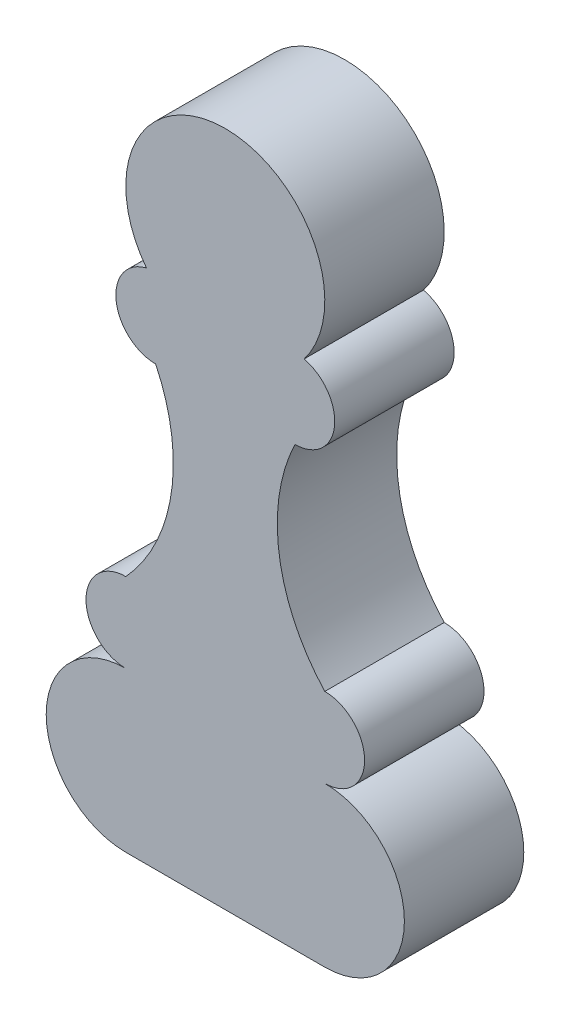
ISO-10303-21;
HEADER;
FILE_DESCRIPTION(('STEP AP214'),'2;1');
FILE_NAME('part.step','',(''),(''),'','','');
FILE_SCHEMA(('AUTOMOTIVE_DESIGN { 1 0 10303 214 1 1 1 1 }'));
ENDSEC;
DATA;
#1=APPLICATION_CONTEXT('core data for automotive mechanical design processes');
#2=APPLICATION_PROTOCOL_DEFINITION('international standard','automotive_design',2000,#1);
#3=PRODUCT_CONTEXT('',#1,'mechanical');
#4=PRODUCT('Part','Part','',(#3));
#5=PRODUCT_RELATED_PRODUCT_CATEGORY('part','',(#4));
#6=PRODUCT_DEFINITION_FORMATION('','',#4);
#7=PRODUCT_DEFINITION_CONTEXT('part definition',#1,'design');
#8=PRODUCT_DEFINITION('design','',#6,#7);
#9=PRODUCT_DEFINITION_SHAPE('','',#8);
#10=(LENGTH_UNIT() NAMED_UNIT(*) SI_UNIT(.MILLI.,.METRE.));
#11=(NAMED_UNIT(*) PLANE_ANGLE_UNIT() SI_UNIT($,.RADIAN.));
#12=(NAMED_UNIT(*) SI_UNIT($,.STERADIAN.) SOLID_ANGLE_UNIT());
#13=UNCERTAINTY_MEASURE_WITH_UNIT(LENGTH_MEASURE(1.E-05),#10,'distance_accuracy_value','');
#14=(GEOMETRIC_REPRESENTATION_CONTEXT(3) GLOBAL_UNCERTAINTY_ASSIGNED_CONTEXT((#13)) GLOBAL_UNIT_ASSIGNED_CONTEXT((#10,
#11,#12)) REPRESENTATION_CONTEXT('',''));
#15=CARTESIAN_POINT('',(0.,0.,0.));
#16=DIRECTION('',(0.,0.,1.));
#17=DIRECTION('',(1.,0.,0.));
#18=AXIS2_PLACEMENT_3D('',#15,#16,#17);
#19=CARTESIAN_POINT('',(25.,-125.,30.));
#20=DIRECTION('',(0.,0.,-1.));
#21=DIRECTION('',(-1.,0.,0.));
#22=AXIS2_PLACEMENT_3D('',#19,#20,#21);
#23=CYLINDRICAL_SURFACE('',#22,20.);
#24=CARTESIAN_POINT('',(25.,-125.,0.));
#25=DIRECTION('',(0.,0.,1.));
#26=DIRECTION('',(1.,0.,0.));
#27=AXIS2_PLACEMENT_3D('',#24,#25,#26);
#28=CIRCLE('',#27,20.);
#29=CARTESIAN_POINT('',(25.,-145.,0.));
#30=VERTEX_POINT('',#29);
#31=CARTESIAN_POINT('',(25.,-105.,0.));
#32=VERTEX_POINT('',#31);
#33=EDGE_CURVE('E141',#30,#32,#28,.T.);
#34=ORIENTED_EDGE('',*,*,#33,.T.);
#35=DIRECTION('',(0.,0.,-1.));
#36=VECTOR('',#35,1.);
#37=CARTESIAN_POINT('',(25.,-105.,30.));
#38=LINE('',#37,#36);
#39=CARTESIAN_POINT('',(25.,-105.,30.));
#40=VERTEX_POINT('',#39);
#41=EDGE_CURVE('E11',#40,#32,#38,.T.);
#42=ORIENTED_EDGE('',*,*,#41,.F.);
#43=CARTESIAN_POINT('',(25.,-125.,30.));
#44=DIRECTION('',(0.,0.,1.));
#45=DIRECTION('',(1.,0.,0.));
#46=AXIS2_PLACEMENT_3D('',#43,#44,#45);
#47=CIRCLE('',#46,20.);
#48=CARTESIAN_POINT('',(25.,-145.,30.));
#49=VERTEX_POINT('',#48);
#50=EDGE_CURVE('E161',#49,#40,#47,.T.);
#51=ORIENTED_EDGE('',*,*,#50,.F.);
#52=DIRECTION('',(0.,0.,-1.));
#53=VECTOR('',#52,1.);
#54=CARTESIAN_POINT('',(25.,-145.,30.));
#55=LINE('',#54,#53);
#56=EDGE_CURVE('E137',#49,#30,#55,.T.);
#57=ORIENTED_EDGE('',*,*,#56,.T.);
#58=EDGE_LOOP('',(#34,#42,#51,#57));
#59=FACE_BOUND('',#58,.T.);
#60=ADVANCED_FACE('F33',(#59),#23,.T.);
#61=CARTESIAN_POINT('',(25.,-95.,30.));
#62=DIRECTION('',(0.,0.,-1.));
#63=DIRECTION('',(-1.,0.,0.));
#64=AXIS2_PLACEMENT_3D('',#61,#62,#63);
#65=CYLINDRICAL_SURFACE('',#64,10.);
#66=CARTESIAN_POINT('',(25.,-95.,0.));
#67=DIRECTION('',(0.,0.,1.));
#68=DIRECTION('',(1.,0.,0.));
#69=AXIS2_PLACEMENT_3D('',#66,#67,#68);
#70=CIRCLE('',#69,10.);
#71=CARTESIAN_POINT('',(25.,-85.,0.));
#72=VERTEX_POINT('',#71);
#73=EDGE_CURVE('E144',#32,#72,#70,.T.);
#74=ORIENTED_EDGE('',*,*,#73,.T.);
#75=DIRECTION('',(0.,0.,-1.));
#76=VECTOR('',#75,1.);
#77=CARTESIAN_POINT('',(25.,-85.,30.));
#78=LINE('',#77,#76);
#79=CARTESIAN_POINT('',(25.,-85.,30.));
#80=VERTEX_POINT('',#79);
#81=EDGE_CURVE('E41',#80,#72,#78,.T.);
#82=ORIENTED_EDGE('',*,*,#81,.F.);
#83=CARTESIAN_POINT('',(25.,-95.,30.));
#84=DIRECTION('',(0.,0.,1.));
#85=DIRECTION('',(1.,0.,0.));
#86=AXIS2_PLACEMENT_3D('',#83,#84,#85);
#87=CIRCLE('',#86,10.);
#88=EDGE_CURVE('E98',#40,#80,#87,.T.);
#89=ORIENTED_EDGE('',*,*,#88,.F.);
#90=ORIENTED_EDGE('',*,*,#41,.T.);
#91=EDGE_LOOP('',(#74,#82,#89,#90));
#92=FACE_BOUND('',#91,.T.);
#93=ADVANCED_FACE('F181',(#92),#65,.T.);
#94=CARTESIAN_POINT('',(58.0663020657902,-54.4775546901315,30.));
#95=DIRECTION('',(0.,0.,-1.));
#96=DIRECTION('',(-1.,0.,0.));
#97=AXIS2_PLACEMENT_3D('',#94,#95,#96);
#98=CYLINDRICAL_SURFACE('',#97,45.);
#99=CARTESIAN_POINT('',(58.0663020657902,-54.4775546901315,0.));
#100=DIRECTION('',(0.,0.,1.));
#101=DIRECTION('',(1.,0.,0.));
#102=AXIS2_PLACEMENT_3D('',#99,#100,#101);
#103=CIRCLE('',#102,45.);
#104=CARTESIAN_POINT('',(17.5,-35.,0.));
#105=VERTEX_POINT('',#104);
#106=EDGE_CURVE('E147',#105,#72,#103,.T.);
#107=ORIENTED_EDGE('',*,*,#106,.F.);
#108=DIRECTION('',(0.,0.,-1.));
#109=VECTOR('',#108,1.);
#110=CARTESIAN_POINT('',(17.5,-35.,30.));
#111=LINE('',#110,#109);
#112=CARTESIAN_POINT('',(17.5,-35.,30.));
#113=VERTEX_POINT('',#112);
#114=EDGE_CURVE('E174',#113,#105,#111,.T.);
#115=ORIENTED_EDGE('',*,*,#114,.F.);
#116=CARTESIAN_POINT('',(58.0663020657902,-54.4775546901315,30.));
#117=DIRECTION('',(0.,0.,1.));
#118=DIRECTION('',(1.,0.,0.));
#119=AXIS2_PLACEMENT_3D('',#116,#117,#118);
#120=CIRCLE('',#119,45.);
#121=EDGE_CURVE('E180',#113,#80,#120,.T.);
#122=ORIENTED_EDGE('',*,*,#121,.T.);
#123=ORIENTED_EDGE('',*,*,#81,.T.);
#124=EDGE_LOOP('',(#107,#115,#122,#123));
#125=FACE_BOUND('',#124,.T.);
#126=ADVANCED_FACE('F178',(#125),#98,.F.);
#127=CARTESIAN_POINT('',(17.5,-25.,30.));
#128=DIRECTION('',(0.,0.,-1.));
#129=DIRECTION('',(-1.,0.,0.));
#130=AXIS2_PLACEMENT_3D('',#127,#128,#129);
#131=CYLINDRICAL_SURFACE('',#130,10.);
#132=CARTESIAN_POINT('',(17.5,-25.,0.));
#133=DIRECTION('',(0.,0.,1.));
#134=DIRECTION('',(1.,0.,0.));
#135=AXIS2_PLACEMENT_3D('',#132,#133,#134);
#136=CIRCLE('',#135,10.);
#137=CARTESIAN_POINT('',(19.7966953057054,-15.2673132860062,0.));
#138=VERTEX_POINT('',#137);
#139=EDGE_CURVE('E150',#105,#138,#136,.T.);
#140=ORIENTED_EDGE('',*,*,#139,.T.);
#141=DIRECTION('',(0.,0.,-1.));
#142=VECTOR('',#141,1.);
#143=CARTESIAN_POINT('',(19.7966953057054,-15.2673132860062,30.));
#144=LINE('',#143,#142);
#145=CARTESIAN_POINT('',(19.7966953057054,-15.2673132860062,30.));
#146=VERTEX_POINT('',#145);
#147=EDGE_CURVE('E171',#146,#138,#144,.T.);
#148=ORIENTED_EDGE('',*,*,#147,.F.);
#149=CARTESIAN_POINT('',(17.5,-25.,30.));
#150=DIRECTION('',(0.,0.,1.));
#151=DIRECTION('',(1.,0.,0.));
#152=AXIS2_PLACEMENT_3D('',#149,#150,#151);
#153=CIRCLE('',#152,10.);
#154=EDGE_CURVE('E200',#113,#146,#153,.T.);
#155=ORIENTED_EDGE('',*,*,#154,.F.);
#156=ORIENTED_EDGE('',*,*,#114,.T.);
#157=EDGE_LOOP('',(#140,#148,#155,#156));
#158=FACE_BOUND('',#157,.T.);
#159=ADVANCED_FACE('F191',(#158),#131,.T.);
#160=CARTESIAN_POINT('',(0.,0.,30.));
#161=DIRECTION('',(0.,0.,-1.));
#162=DIRECTION('',(-1.,0.,0.));
#163=AXIS2_PLACEMENT_3D('',#160,#161,#162);
#164=CYLINDRICAL_SURFACE('',#163,25.);
#165=CARTESIAN_POINT('',(0.,0.,0.));
#166=DIRECTION('',(0.,0.,1.));
#167=DIRECTION('',(1.,0.,0.));
#168=AXIS2_PLACEMENT_3D('',#165,#166,#167);
#169=CIRCLE('',#168,25.);
#170=CARTESIAN_POINT('',(-19.7966953057054,-15.2673132860062,0.));
#171=VERTEX_POINT('',#170);
#172=EDGE_CURVE('E152',#138,#171,#169,.T.);
#173=ORIENTED_EDGE('',*,*,#172,.T.);
#174=DIRECTION('',(0.,0.,-1.));
#175=VECTOR('',#174,1.);
#176=CARTESIAN_POINT('',(-19.7966953057054,-15.2673132860062,30.));
#177=LINE('',#176,#175);
#178=CARTESIAN_POINT('',(-19.7966953057054,-15.2673132860062,30.));
#179=VERTEX_POINT('',#178);
#180=EDGE_CURVE('E168',#179,#171,#177,.T.);
#181=ORIENTED_EDGE('',*,*,#180,.F.);
#182=CARTESIAN_POINT('',(0.,0.,30.));
#183=DIRECTION('',(0.,0.,1.));
#184=DIRECTION('',(1.,0.,0.));
#185=AXIS2_PLACEMENT_3D('',#182,#183,#184);
#186=CIRCLE('',#185,25.);
#187=EDGE_CURVE('E197',#146,#179,#186,.T.);
#188=ORIENTED_EDGE('',*,*,#187,.F.);
#189=ORIENTED_EDGE('',*,*,#147,.T.);
#190=EDGE_LOOP('',(#173,#181,#188,#189));
#191=FACE_BOUND('',#190,.T.);
#192=ADVANCED_FACE('F195',(#191),#164,.T.);
#193=CARTESIAN_POINT('',(-17.5,-25.,30.));
#194=DIRECTION('',(0.,0.,-1.));
#195=DIRECTION('',(-1.,0.,0.));
#196=AXIS2_PLACEMENT_3D('',#193,#194,#195);
#197=CYLINDRICAL_SURFACE('',#196,10.);
#198=CARTESIAN_POINT('',(-17.5,-25.,0.));
#199=DIRECTION('',(0.,0.,1.));
#200=DIRECTION('',(1.,0.,0.));
#201=AXIS2_PLACEMENT_3D('',#198,#199,#200);
#202=CIRCLE('',#201,10.);
#203=CARTESIAN_POINT('',(-17.5,-35.,0.));
#204=VERTEX_POINT('',#203);
#205=EDGE_CURVE('E154',#171,#204,#202,.T.);
#206=ORIENTED_EDGE('',*,*,#205,.T.);
#207=DIRECTION('',(0.,0.,-1.));
#208=VECTOR('',#207,1.);
#209=CARTESIAN_POINT('',(-17.5,-35.,30.));
#210=LINE('',#209,#208);
#211=CARTESIAN_POINT('',(-17.5,-35.,30.));
#212=VERTEX_POINT('',#211);
#213=EDGE_CURVE('E165',#212,#204,#210,.T.);
#214=ORIENTED_EDGE('',*,*,#213,.F.);
#215=CARTESIAN_POINT('',(-17.5,-25.,30.));
#216=DIRECTION('',(0.,0.,1.));
#217=DIRECTION('',(1.,0.,0.));
#218=AXIS2_PLACEMENT_3D('',#215,#216,#217);
#219=CIRCLE('',#218,10.);
#220=EDGE_CURVE('E199',#179,#212,#219,.T.);
#221=ORIENTED_EDGE('',*,*,#220,.F.);
#222=ORIENTED_EDGE('',*,*,#180,.T.);
#223=EDGE_LOOP('',(#206,#214,#221,#222));
#224=FACE_BOUND('',#223,.T.);
#225=ADVANCED_FACE('F214',(#224),#197,.T.);
#226=CARTESIAN_POINT('',(-58.0663020657902,-54.4775546901315,30.));
#227=DIRECTION('',(0.,0.,-1.));
#228=DIRECTION('',(-1.,0.,0.));
#229=AXIS2_PLACEMENT_3D('',#226,#227,#228);
#230=CYLINDRICAL_SURFACE('',#229,45.);
#231=CARTESIAN_POINT('',(-58.0663020657902,-54.4775546901315,0.));
#232=DIRECTION('',(0.,0.,1.));
#233=DIRECTION('',(1.,0.,0.));
#234=AXIS2_PLACEMENT_3D('',#231,#232,#233);
#235=CIRCLE('',#234,45.);
#236=CARTESIAN_POINT('',(-25.,-85.,0.));
#237=VERTEX_POINT('',#236);
#238=EDGE_CURVE('E156',#204,#237,#235,.F.);
#239=ORIENTED_EDGE('',*,*,#238,.T.);
#240=DIRECTION('',(0.,0.,-1.));
#241=VECTOR('',#240,1.);
#242=CARTESIAN_POINT('',(-25.,-85.,30.));
#243=LINE('',#242,#241);
#244=CARTESIAN_POINT('',(-25.,-85.,30.));
#245=VERTEX_POINT('',#244);
#246=EDGE_CURVE('E132',#245,#237,#243,.T.);
#247=ORIENTED_EDGE('',*,*,#246,.F.);
#248=CARTESIAN_POINT('',(-58.0663020657902,-54.4775546901315,30.));
#249=DIRECTION('',(0.,0.,1.));
#250=DIRECTION('',(1.,0.,0.));
#251=AXIS2_PLACEMENT_3D('',#248,#249,#250);
#252=CIRCLE('',#251,45.);
#253=EDGE_CURVE('E123',#212,#245,#252,.F.);
#254=ORIENTED_EDGE('',*,*,#253,.F.);
#255=ORIENTED_EDGE('',*,*,#213,.T.);
#256=EDGE_LOOP('',(#239,#247,#254,#255));
#257=FACE_BOUND('',#256,.T.);
#258=ADVANCED_FACE('F211',(#257),#230,.F.);
#259=CARTESIAN_POINT('',(-25.,-95.,30.));
#260=DIRECTION('',(0.,0.,-1.));
#261=DIRECTION('',(-1.,0.,0.));
#262=AXIS2_PLACEMENT_3D('',#259,#260,#261);
#263=CYLINDRICAL_SURFACE('',#262,10.);
#264=CARTESIAN_POINT('',(-25.,-95.,0.));
#265=DIRECTION('',(0.,0.,1.));
#266=DIRECTION('',(1.,0.,0.));
#267=AXIS2_PLACEMENT_3D('',#264,#265,#266);
#268=CIRCLE('',#267,10.);
#269=CARTESIAN_POINT('',(-25.,-105.,0.));
#270=VERTEX_POINT('',#269);
#271=EDGE_CURVE('E131',#237,#270,#268,.T.);
#272=ORIENTED_EDGE('',*,*,#271,.T.);
#273=DIRECTION('',(0.,0.,-1.));
#274=VECTOR('',#273,1.);
#275=CARTESIAN_POINT('',(-25.,-105.,30.));
#276=LINE('',#275,#274);
#277=CARTESIAN_POINT('',(-25.,-105.,30.));
#278=VERTEX_POINT('',#277);
#279=EDGE_CURVE('E128',#278,#270,#276,.T.);
#280=ORIENTED_EDGE('',*,*,#279,.F.);
#281=CARTESIAN_POINT('',(-25.,-95.,30.));
#282=DIRECTION('',(0.,0.,1.));
#283=DIRECTION('',(1.,0.,0.));
#284=AXIS2_PLACEMENT_3D('',#281,#282,#283);
#285=CIRCLE('',#284,10.);
#286=EDGE_CURVE('E117',#245,#278,#285,.T.);
#287=ORIENTED_EDGE('',*,*,#286,.F.);
#288=ORIENTED_EDGE('',*,*,#246,.T.);
#289=EDGE_LOOP('',(#272,#280,#287,#288));
#290=FACE_BOUND('',#289,.T.);
#291=ADVANCED_FACE('F129',(#290),#263,.T.);
#292=CARTESIAN_POINT('',(-25.,-125.,30.));
#293=DIRECTION('',(0.,0.,-1.));
#294=DIRECTION('',(-1.,0.,0.));
#295=AXIS2_PLACEMENT_3D('',#292,#293,#294);
#296=CYLINDRICAL_SURFACE('',#295,20.);
#297=CARTESIAN_POINT('',(-25.,-125.,0.));
#298=DIRECTION('',(0.,0.,1.));
#299=DIRECTION('',(1.,0.,0.));
#300=AXIS2_PLACEMENT_3D('',#297,#298,#299);
#301=CIRCLE('',#300,20.);
#302=CARTESIAN_POINT('',(-25.,-145.,0.));
#303=VERTEX_POINT('',#302);
#304=EDGE_CURVE('E84',#270,#303,#301,.T.);
#305=ORIENTED_EDGE('',*,*,#304,.T.);
#306=DIRECTION('',(0.,0.,-1.));
#307=VECTOR('',#306,1.);
#308=CARTESIAN_POINT('',(-25.,-145.,30.));
#309=LINE('',#308,#307);
#310=CARTESIAN_POINT('',(-25.,-145.,30.));
#311=VERTEX_POINT('',#310);
#312=EDGE_CURVE('E133',#311,#303,#309,.T.);
#313=ORIENTED_EDGE('',*,*,#312,.F.);
#314=CARTESIAN_POINT('',(-25.,-125.,30.));
#315=DIRECTION('',(0.,0.,1.));
#316=DIRECTION('',(1.,0.,0.));
#317=AXIS2_PLACEMENT_3D('',#314,#315,#316);
#318=CIRCLE('',#317,20.);
#319=EDGE_CURVE('E121',#278,#311,#318,.T.);
#320=ORIENTED_EDGE('',*,*,#319,.F.);
#321=ORIENTED_EDGE('',*,*,#279,.T.);
#322=EDGE_LOOP('',(#305,#313,#320,#321));
#323=FACE_BOUND('',#322,.T.);
#324=ADVANCED_FACE('F135',(#323),#296,.T.);
#325=CARTESIAN_POINT('',(0.,-145.,30.));
#326=DIRECTION('',(0.,1.,0.));
#327=DIRECTION('',(0.,0.,1.));
#328=AXIS2_PLACEMENT_3D('',#325,#326,#327);
#329=PLANE('',#328);
#330=DIRECTION('',(1.,0.,0.));
#331=VECTOR('',#330,1.);
#332=CARTESIAN_POINT('',(0.,-145.,0.));
#333=LINE('',#332,#331);
#334=EDGE_CURVE('E90',#303,#30,#333,.T.);
#335=ORIENTED_EDGE('',*,*,#334,.T.);
#336=ORIENTED_EDGE('',*,*,#56,.F.);
#337=DIRECTION('',(1.,0.,0.));
#338=VECTOR('',#337,1.);
#339=CARTESIAN_POINT('',(0.,-145.,30.));
#340=LINE('',#339,#338);
#341=EDGE_CURVE('E49',#311,#49,#340,.T.);
#342=ORIENTED_EDGE('',*,*,#341,.F.);
#343=ORIENTED_EDGE('',*,*,#312,.T.);
#344=EDGE_LOOP('',(#335,#336,#342,#343));
#345=FACE_BOUND('',#344,.T.);
#346=ADVANCED_FACE('F268',(#345),#329,.F.);
#347=CARTESIAN_POINT('',(0.,0.,30.));
#348=DIRECTION('',(0.,0.,1.));
#349=DIRECTION('',(1.,0.,0.));
#350=AXIS2_PLACEMENT_3D('',#347,#348,#349);
#351=PLANE('',#350);
#352=ORIENTED_EDGE('',*,*,#50,.T.);
#353=ORIENTED_EDGE('',*,*,#88,.T.);
#354=ORIENTED_EDGE('',*,*,#121,.F.);
#355=ORIENTED_EDGE('',*,*,#154,.T.);
#356=ORIENTED_EDGE('',*,*,#187,.T.);
#357=ORIENTED_EDGE('',*,*,#220,.T.);
#358=ORIENTED_EDGE('',*,*,#253,.T.);
#359=ORIENTED_EDGE('',*,*,#286,.T.);
#360=ORIENTED_EDGE('',*,*,#319,.T.);
#361=ORIENTED_EDGE('',*,*,#341,.T.);
#362=EDGE_LOOP('',(#352,#353,#354,#355,#356,#357,#358,#359,#360,#361));
#363=FACE_BOUND('',#362,.T.);
#364=ADVANCED_FACE('F119',(#363),#351,.T.);
#365=CARTESIAN_POINT('',(0.,0.,0.));
#366=DIRECTION('',(0.,0.,1.));
#367=DIRECTION('',(1.,0.,0.));
#368=AXIS2_PLACEMENT_3D('',#365,#366,#367);
#369=PLANE('',#368);
#370=ORIENTED_EDGE('',*,*,#33,.F.);
#371=ORIENTED_EDGE('',*,*,#334,.F.);
#372=ORIENTED_EDGE('',*,*,#304,.F.);
#373=ORIENTED_EDGE('',*,*,#271,.F.);
#374=ORIENTED_EDGE('',*,*,#238,.F.);
#375=ORIENTED_EDGE('',*,*,#205,.F.);
#376=ORIENTED_EDGE('',*,*,#172,.F.);
#377=ORIENTED_EDGE('',*,*,#139,.F.);
#378=ORIENTED_EDGE('',*,*,#106,.T.);
#379=ORIENTED_EDGE('',*,*,#73,.F.);
#380=EDGE_LOOP('',(#370,#371,#372,#373,#374,#375,#376,#377,#378,#379));
#381=FACE_BOUND('',#380,.T.);
#382=ADVANCED_FACE('F186',(#381),#369,.F.);
#383=CLOSED_SHELL('',(#60,#93,#126,#159,#192,#225,#258,#291,#324,#346,#364,#382));
#384=MANIFOLD_SOLID_BREP('B2',#383);
#385=ADVANCED_BREP_SHAPE_REPRESENTATION('',(#18,#384),#14);
#386=SHAPE_DEFINITION_REPRESENTATION(#9,#385);
ENDSEC;
END-ISO-10303-21;
